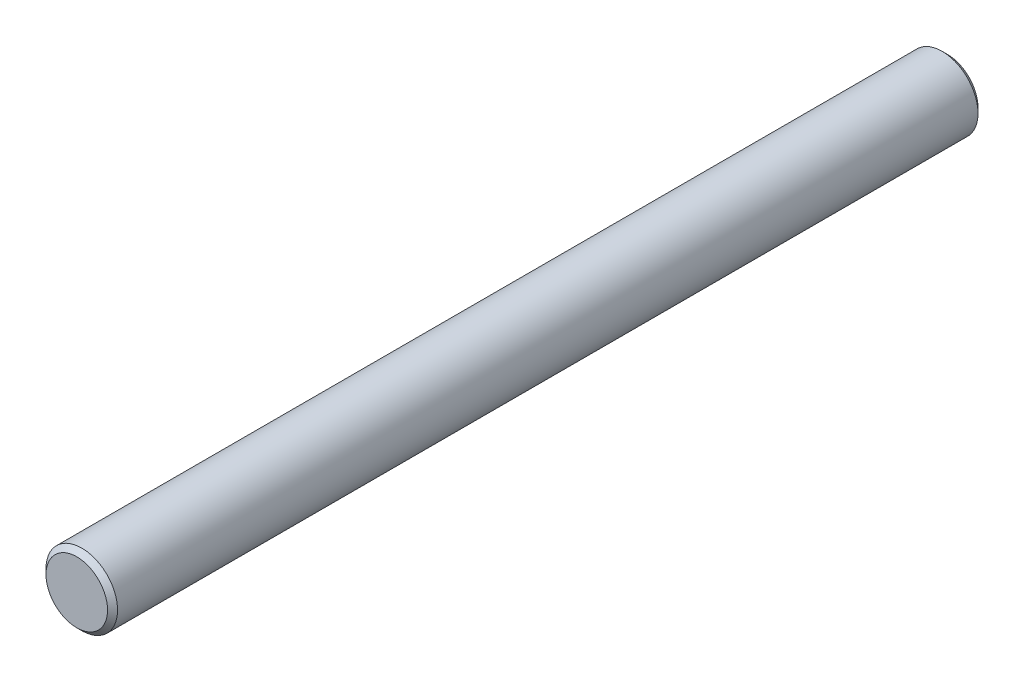
ISO-10303-21;
HEADER;
FILE_DESCRIPTION(('STEP AP214'),'2;1');
FILE_NAME('part.step','',(''),(''),'','','');
FILE_SCHEMA(('AUTOMOTIVE_DESIGN { 1 0 10303 214 1 1 1 1 }'));
ENDSEC;
DATA;
#1=APPLICATION_CONTEXT('core data for automotive mechanical design processes');
#2=APPLICATION_PROTOCOL_DEFINITION('international standard','automotive_design',2000,#1);
#3=PRODUCT_CONTEXT('',#1,'mechanical');
#4=PRODUCT('Part','Part','',(#3));
#5=PRODUCT_RELATED_PRODUCT_CATEGORY('part','',(#4));
#6=PRODUCT_DEFINITION_FORMATION('','',#4);
#7=PRODUCT_DEFINITION_CONTEXT('part definition',#1,'design');
#8=PRODUCT_DEFINITION('design','',#6,#7);
#9=PRODUCT_DEFINITION_SHAPE('','',#8);
#10=(LENGTH_UNIT() NAMED_UNIT(*) SI_UNIT(.MILLI.,.METRE.));
#11=(NAMED_UNIT(*) PLANE_ANGLE_UNIT() SI_UNIT($,.RADIAN.));
#12=(NAMED_UNIT(*) SI_UNIT($,.STERADIAN.) SOLID_ANGLE_UNIT());
#13=UNCERTAINTY_MEASURE_WITH_UNIT(LENGTH_MEASURE(1.E-05),#10,'distance_accuracy_value','');
#14=(GEOMETRIC_REPRESENTATION_CONTEXT(3) GLOBAL_UNCERTAINTY_ASSIGNED_CONTEXT((#13)) GLOBAL_UNIT_ASSIGNED_CONTEXT((#10,
#11,#12)) REPRESENTATION_CONTEXT('',''));
#15=CARTESIAN_POINT('',(0.,0.,0.));
#16=DIRECTION('',(0.,0.,1.));
#17=DIRECTION('',(1.,0.,0.));
#18=AXIS2_PLACEMENT_3D('',#15,#16,#17);
#19=CARTESIAN_POINT('',(0.,0.,48.26));
#20=DIRECTION('',(0.,0.,-1.));
#21=DIRECTION('',(-1.,0.,0.));
#22=AXIS2_PLACEMENT_3D('',#19,#20,#21);
#23=CYLINDRICAL_SURFACE('',#22,3.96875);
#24=CARTESIAN_POINT('',(0.,0.,-47.7043749999999));
#25=DIRECTION('',(0.,0.,1.));
#26=DIRECTION('',(1.,0.,0.));
#27=AXIS2_PLACEMENT_3D('',#24,#25,#26);
#28=CIRCLE('',#27,3.96875);
#29=CARTESIAN_POINT('',(-3.96875,0.,-47.7043749999999));
#30=VERTEX_POINT('',#29);
#31=EDGE_CURVE('E50',#30,#30,#28,.T.);
#32=CARTESIAN_POINT('',(0.,0.,47.704375));
#33=DIRECTION('',(0.,0.,1.));
#34=DIRECTION('',(1.,0.,0.));
#35=AXIS2_PLACEMENT_3D('',#32,#33,#34);
#36=CIRCLE('',#35,3.96875);
#37=CARTESIAN_POINT('',(-3.96875,0.,47.704375));
#38=VERTEX_POINT('',#37);
#39=EDGE_CURVE('E54',#38,#38,#36,.F.);
#40=CARTESIAN_POINT('',(-3.96875,0.,-47.7043749999999));
#41=CARTESIAN_POINT('',(-3.96875,0.,-46.7105338541666));
#42=CARTESIAN_POINT('',(-3.96875,0.,-45.7166927083333));
#43=CARTESIAN_POINT('',(-3.96875,0.,-43.7290104166666));
#44=CARTESIAN_POINT('',(-3.96875,0.,-42.7351692708333));
#45=CARTESIAN_POINT('',(-3.96875,0.,-40.7474869791666));
#46=CARTESIAN_POINT('',(-3.96875,0.,-39.7536458333333));
#47=CARTESIAN_POINT('',(-3.96875,0.,-37.7659635416666));
#48=CARTESIAN_POINT('',(-3.96875,0.,-36.7721223958333));
#49=CARTESIAN_POINT('',(-3.96875,0.,-34.7844401041666));
#50=CARTESIAN_POINT('',(-3.96875,0.,-33.7905989583333));
#51=CARTESIAN_POINT('',(-3.96875,0.,-31.8029166666666));
#52=CARTESIAN_POINT('',(-3.96875,0.,-30.8090755208333));
#53=CARTESIAN_POINT('',(-3.96875,0.,-28.8213932291666));
#54=CARTESIAN_POINT('',(-3.96875,0.,-27.8275520833333));
#55=CARTESIAN_POINT('',(-3.96875,0.,-25.8398697916666));
#56=CARTESIAN_POINT('',(-3.96875,0.,-24.8460286458333));
#57=CARTESIAN_POINT('',(-3.96875,0.,-22.8583463541666));
#58=CARTESIAN_POINT('',(-3.96875,0.,-21.8645052083333));
#59=CARTESIAN_POINT('',(-3.96875,0.,-19.8768229166666));
#60=CARTESIAN_POINT('',(-3.96875,0.,-18.8829817708333));
#61=CARTESIAN_POINT('',(-3.96875,0.,-16.8952994791666));
#62=CARTESIAN_POINT('',(-3.96875,0.,-15.9014583333333));
#63=CARTESIAN_POINT('',(-3.96875,0.,-13.9137760416666));
#64=CARTESIAN_POINT('',(-3.96875,0.,-12.9199348958333));
#65=CARTESIAN_POINT('',(-3.96875,0.,-10.9322526041666));
#66=CARTESIAN_POINT('',(-3.96875,0.,-9.93841145833329));
#67=CARTESIAN_POINT('',(-3.96875,0.,-7.95072916666662));
#68=CARTESIAN_POINT('',(-3.96875,0.,-6.95688802083329));
#69=CARTESIAN_POINT('',(-3.96875,0.,-4.96920572916663));
#70=CARTESIAN_POINT('',(-3.96875,0.,-3.97536458333329));
#71=CARTESIAN_POINT('',(-3.96875,0.,-1.98768229166663));
#72=CARTESIAN_POINT('',(-3.96875,0.,-0.993841145833292));
#73=CARTESIAN_POINT('',(-3.96875,0.,0.993841145833375));
#74=CARTESIAN_POINT('',(-3.96875,0.,1.98768229166671));
#75=CARTESIAN_POINT('',(-3.96875,0.,3.97536458333338));
#76=CARTESIAN_POINT('',(-3.96875,0.,4.96920572916671));
#77=CARTESIAN_POINT('',(-3.96875,0.,6.95688802083338));
#78=CARTESIAN_POINT('',(-3.96875,0.,7.95072916666671));
#79=CARTESIAN_POINT('',(-3.96875,0.,9.93841145833337));
#80=CARTESIAN_POINT('',(-3.96875,0.,10.9322526041667));
#81=CARTESIAN_POINT('',(-3.96875,0.,12.9199348958334));
#82=CARTESIAN_POINT('',(-3.96875,0.,13.9137760416667));
#83=CARTESIAN_POINT('',(-3.96875,0.,15.9014583333334));
#84=CARTESIAN_POINT('',(-3.96875,0.,16.8952994791667));
#85=CARTESIAN_POINT('',(-3.96875,0.,18.8829817708334));
#86=CARTESIAN_POINT('',(-3.96875,0.,19.8768229166667));
#87=CARTESIAN_POINT('',(-3.96875,0.,21.8645052083334));
#88=CARTESIAN_POINT('',(-3.96875,0.,22.8583463541667));
#89=CARTESIAN_POINT('',(-3.96875,0.,24.8460286458334));
#90=CARTESIAN_POINT('',(-3.96875,0.,25.8398697916667));
#91=CARTESIAN_POINT('',(-3.96875,0.,27.8275520833334));
#92=CARTESIAN_POINT('',(-3.96875,0.,28.8213932291667));
#93=CARTESIAN_POINT('',(-3.96875,0.,30.8090755208334));
#94=CARTESIAN_POINT('',(-3.96875,0.,31.8029166666667));
#95=CARTESIAN_POINT('',(-3.96875,0.,33.7905989583334));
#96=CARTESIAN_POINT('',(-3.96875,0.,34.7844401041667));
#97=CARTESIAN_POINT('',(-3.96875,0.,36.7721223958334));
#98=CARTESIAN_POINT('',(-3.96875,0.,37.7659635416667));
#99=CARTESIAN_POINT('',(-3.96875,0.,39.7536458333334));
#100=CARTESIAN_POINT('',(-3.96875,0.,40.7474869791667));
#101=CARTESIAN_POINT('',(-3.96875,0.,42.7351692708334));
#102=CARTESIAN_POINT('',(-3.96875,0.,43.7290104166667));
#103=CARTESIAN_POINT('',(-3.96875,0.,45.7166927083334));
#104=CARTESIAN_POINT('',(-3.96875,0.,46.7105338541667));
#105=CARTESIAN_POINT('',(-3.96875,0.,47.704375));
#106=B_SPLINE_CURVE_WITH_KNOTS('',3,(#40,#41,#42,#43,#44,#45,#46,#47,#48,#49,#50,#51,#52,#53,
#54,#55,#56,#57,#58,#59,#60,#61,#62,#63,#64,#65,#66,#67,#68,#69,#70,#71,#72,#73,#74,#75,#76,#77,
#78,#79,#80,#81,#82,#83,#84,#85,#86,#87,#88,#89,#90,#91,#92,#93,#94,#95,#96,#97,#98,#99,#100,
#101,#102,#103,#104,#105),.UNSPECIFIED.,.F.,.F.,(4,2,2,2,2,2,2,2,2,2,2,2,2,2,2,2,2,2,2,2,2,2,2,
2,2,2,2,2,2,2,2,2,4),(0.,2.98152343749999,5.963046875,8.9445703125,11.92609375,14.9076171875,
17.889140625,20.8706640625,23.8521875,26.8337109375,29.815234375,32.7967578125,35.77828125,
38.7598046875,41.741328125,44.7228515625,47.704375,50.6858984375,53.667421875,56.6489453125,
59.63046875,62.6119921875,65.593515625,68.5750390625,71.5565625,74.5380859375,77.519609375,
80.5011328125,83.48265625,86.4641796875,89.445703125,92.4272265625,95.40875),.UNSPECIFIED.);
#107=EDGE_CURVE('BSEAM39',#30,#38,#106,.T.);
#108=ORIENTED_EDGE('',*,*,#31,.T.);
#109=ORIENTED_EDGE('',*,*,#39,.T.);
#110=ORIENTED_EDGE('',*,*,#107,.T.);
#111=ORIENTED_EDGE('',*,*,#107,.F.);
#112=EDGE_LOOP('',(#108,#110,#109,#111));
#113=FACE_BOUND('',#112,.T.);
#114=ADVANCED_FACE('F39',(#113),#23,.T.);
#115=CARTESIAN_POINT('',(0.,0.,48.26));
#116=DIRECTION('',(0.,0.,1.));
#117=DIRECTION('',(1.,0.,0.));
#118=AXIS2_PLACEMENT_3D('',#115,#116,#117);
#119=PLANE('',#118);
#120=CARTESIAN_POINT('',(0.,0.,48.26));
#121=DIRECTION('',(0.,0.,1.));
#122=DIRECTION('',(1.,0.,0.));
#123=AXIS2_PLACEMENT_3D('',#120,#121,#122);
#124=CIRCLE('',#123,3.41312500000006);
#125=CARTESIAN_POINT('',(3.41312500000006,0.,48.26));
#126=VERTEX_POINT('',#125);
#127=EDGE_CURVE('E10',#126,#126,#124,.T.);
#128=ORIENTED_EDGE('',*,*,#127,.T.);
#129=EDGE_LOOP('',(#128));
#130=FACE_BOUND('',#129,.T.);
#131=ADVANCED_FACE('F70',(#130),#119,.T.);
#132=CARTESIAN_POINT('',(0.,0.,-48.26));
#133=DIRECTION('',(0.,0.,1.));
#134=DIRECTION('',(1.,0.,0.));
#135=AXIS2_PLACEMENT_3D('',#132,#133,#134);
#136=PLANE('',#135);
#137=CARTESIAN_POINT('',(0.,0.,-48.26));
#138=DIRECTION('',(0.,0.,1.));
#139=DIRECTION('',(1.,0.,0.));
#140=AXIS2_PLACEMENT_3D('',#137,#138,#139);
#141=CIRCLE('',#140,3.41312499999993);
#142=CARTESIAN_POINT('',(3.41312499999993,0.,-48.26));
#143=VERTEX_POINT('',#142);
#144=EDGE_CURVE('E46',#143,#143,#141,.F.);
#145=ORIENTED_EDGE('',*,*,#144,.T.);
#146=EDGE_LOOP('',(#145));
#147=FACE_BOUND('',#146,.T.);
#148=ADVANCED_FACE('F67',(#147),#136,.F.);
#149=CARTESIAN_POINT('',(0.,0.,-47.7043749999999));
#150=DIRECTION('',(0.,0.,1.));
#151=DIRECTION('',(1.,0.,0.));
#152=AXIS2_PLACEMENT_3D('',#149,#150,#151);
#153=CONICAL_SURFACE('',#152,3.96875,0.785398163397455);
#154=ORIENTED_EDGE('',*,*,#144,.F.);
#155=EDGE_LOOP('',(#154));
#156=FACE_BOUND('',#155,.T.);
#157=ORIENTED_EDGE('',*,*,#31,.F.);
#158=EDGE_LOOP('',(#157));
#159=FACE_BOUND('',#158,.T.);
#160=ADVANCED_FACE('F63',(#156,#159),#153,.T.);
#161=CARTESIAN_POINT('',(0.,0.,48.26));
#162=DIRECTION('',(0.,0.,-1.));
#163=DIRECTION('',(-1.,0.,0.));
#164=AXIS2_PLACEMENT_3D('',#161,#162,#163);
#165=CONICAL_SURFACE('',#164,3.41312500000006,0.785398163397437);
#166=ORIENTED_EDGE('',*,*,#39,.F.);
#167=EDGE_LOOP('',(#166));
#168=FACE_BOUND('',#167,.T.);
#169=ORIENTED_EDGE('',*,*,#127,.F.);
#170=EDGE_LOOP('',(#169));
#171=FACE_BOUND('',#170,.T.);
#172=ADVANCED_FACE('F41',(#168,#171),#165,.T.);
#173=CLOSED_SHELL('',(#114,#131,#148,#160,#172));
#174=MANIFOLD_SOLID_BREP('B2',#173);
#175=ADVANCED_BREP_SHAPE_REPRESENTATION('',(#18,#174),#14);
#176=SHAPE_DEFINITION_REPRESENTATION(#9,#175);
ENDSEC;
END-ISO-10303-21;
